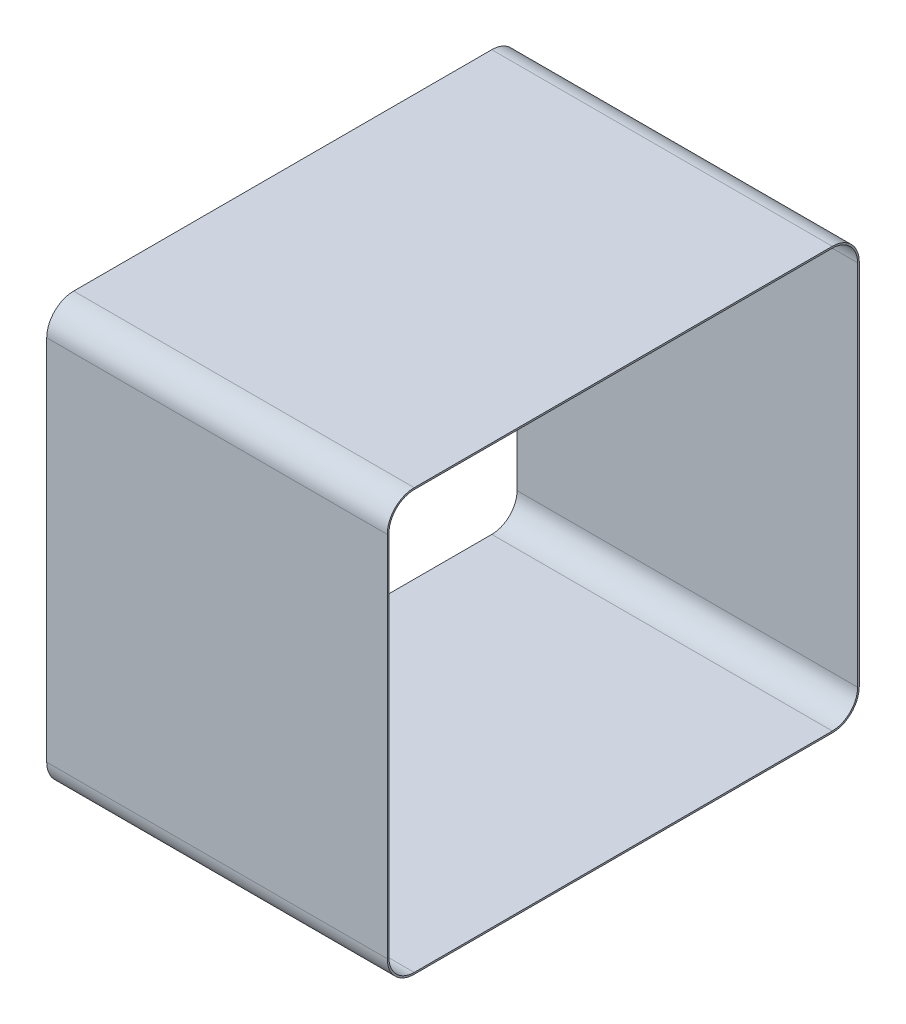
ISO-10303-21;
HEADER;
FILE_DESCRIPTION(('STEP AP214'),'2;1');
FILE_NAME('part.step','',(''),(''),'','','');
FILE_SCHEMA(('AUTOMOTIVE_DESIGN { 1 0 10303 214 1 1 1 1 }'));
ENDSEC;
DATA;
#1=APPLICATION_CONTEXT('core data for automotive mechanical design processes');
#2=APPLICATION_PROTOCOL_DEFINITION('international standard','automotive_design',2000,#1);
#3=PRODUCT_CONTEXT('',#1,'mechanical');
#4=PRODUCT('Part','Part','',(#3));
#5=PRODUCT_RELATED_PRODUCT_CATEGORY('part','',(#4));
#6=PRODUCT_DEFINITION_FORMATION('','',#4);
#7=PRODUCT_DEFINITION_CONTEXT('part definition',#1,'design');
#8=PRODUCT_DEFINITION('design','',#6,#7);
#9=PRODUCT_DEFINITION_SHAPE('','',#8);
#10=(LENGTH_UNIT() NAMED_UNIT(*) SI_UNIT(.MILLI.,.METRE.));
#11=(NAMED_UNIT(*) PLANE_ANGLE_UNIT() SI_UNIT($,.RADIAN.));
#12=(NAMED_UNIT(*) SI_UNIT($,.STERADIAN.) SOLID_ANGLE_UNIT());
#13=UNCERTAINTY_MEASURE_WITH_UNIT(LENGTH_MEASURE(1.E-05),#10,'distance_accuracy_value','');
#14=(GEOMETRIC_REPRESENTATION_CONTEXT(3) GLOBAL_UNCERTAINTY_ASSIGNED_CONTEXT((#13)) GLOBAL_UNIT_ASSIGNED_CONTEXT((#10,
#11,#12)) REPRESENTATION_CONTEXT('',''));
#15=CARTESIAN_POINT('',(0.,0.,0.));
#16=DIRECTION('',(0.,0.,1.));
#17=DIRECTION('',(1.,0.,0.));
#18=AXIS2_PLACEMENT_3D('',#15,#16,#17);
#19=CARTESIAN_POINT('',(0.505,0.,0.7));
#20=DIRECTION('',(1.,0.,0.));
#21=DIRECTION('',(0.,1.,0.));
#22=AXIS2_PLACEMENT_3D('',#19,#20,#21);
#23=PLANE('',#22);
#24=DIRECTION('',(0.,1.,0.));
#25=VECTOR('',#24,1.);
#26=CARTESIAN_POINT('',(0.505,-0.545,1.395));
#27=LINE('',#26,#25);
#28=CARTESIAN_POINT('',(0.505,-0.545,1.395));
#29=VERTEX_POINT('',#28);
#30=CARTESIAN_POINT('',(0.505,0.545,1.395));
#31=VERTEX_POINT('',#30);
#32=EDGE_CURVE('E256',#29,#31,#27,.T.);
#33=ORIENTED_EDGE('',*,*,#32,.T.);
#34=CARTESIAN_POINT('',(0.505,0.545,1.32));
#35=DIRECTION('',(-1.,0.,0.));
#36=DIRECTION('',(0.,-1.,0.));
#37=AXIS2_PLACEMENT_3D('',#34,#35,#36);
#38=CIRCLE('',#37,0.075);
#39=CARTESIAN_POINT('',(0.505,0.62,1.32));
#40=VERTEX_POINT('',#39);
#41=EDGE_CURVE('E11',#31,#40,#38,.T.);
#42=ORIENTED_EDGE('',*,*,#41,.T.);
#43=DIRECTION('',(0.,0.,-1.));
#44=VECTOR('',#43,1.);
#45=CARTESIAN_POINT('',(0.505,0.62,1.32));
#46=LINE('',#45,#44);
#47=CARTESIAN_POINT('',(0.505,0.62,0.08));
#48=VERTEX_POINT('',#47);
#49=EDGE_CURVE('E26',#40,#48,#46,.T.);
#50=ORIENTED_EDGE('',*,*,#49,.T.);
#51=CARTESIAN_POINT('',(0.505,0.545,0.08));
#52=DIRECTION('',(-1.,0.,0.));
#53=DIRECTION('',(0.,0.,1.));
#54=AXIS2_PLACEMENT_3D('',#51,#52,#53);
#55=CIRCLE('',#54,0.075);
#56=CARTESIAN_POINT('',(0.505,0.545,0.005));
#57=VERTEX_POINT('',#56);
#58=EDGE_CURVE('E248',#48,#57,#55,.T.);
#59=ORIENTED_EDGE('',*,*,#58,.T.);
#60=DIRECTION('',(0.,-1.,0.));
#61=VECTOR('',#60,1.);
#62=CARTESIAN_POINT('',(0.505,0.545,0.005));
#63=LINE('',#62,#61);
#64=CARTESIAN_POINT('',(0.505,-0.545,0.005));
#65=VERTEX_POINT('',#64);
#66=EDGE_CURVE('E303',#57,#65,#63,.T.);
#67=ORIENTED_EDGE('',*,*,#66,.T.);
#68=CARTESIAN_POINT('',(0.505,-0.545,0.08));
#69=DIRECTION('',(-1.,0.,0.));
#70=DIRECTION('',(0.,1.,0.));
#71=AXIS2_PLACEMENT_3D('',#68,#69,#70);
#72=CIRCLE('',#71,0.075);
#73=CARTESIAN_POINT('',(0.505,-0.62,0.08));
#74=VERTEX_POINT('',#73);
#75=EDGE_CURVE('E239',#65,#74,#72,.T.);
#76=ORIENTED_EDGE('',*,*,#75,.T.);
#77=DIRECTION('',(0.,0.,1.));
#78=VECTOR('',#77,1.);
#79=CARTESIAN_POINT('',(0.505,-0.62,0.08));
#80=LINE('',#79,#78);
#81=CARTESIAN_POINT('',(0.505,-0.62,1.32));
#82=VERTEX_POINT('',#81);
#83=EDGE_CURVE('E296',#74,#82,#80,.T.);
#84=ORIENTED_EDGE('',*,*,#83,.T.);
#85=CARTESIAN_POINT('',(0.505,-0.545,1.32));
#86=DIRECTION('',(-1.,0.,0.));
#87=DIRECTION('',(0.,0.,-1.));
#88=AXIS2_PLACEMENT_3D('',#85,#86,#87);
#89=CIRCLE('',#88,0.075);
#90=EDGE_CURVE('E216',#82,#29,#89,.T.);
#91=ORIENTED_EDGE('',*,*,#90,.T.);
#92=EDGE_LOOP('',(#33,#42,#50,#59,#67,#76,#84,#91));
#93=FACE_BOUND('',#92,.T.);
#94=CARTESIAN_POINT('',(0.505,-0.545,0.08));
#95=DIRECTION('',(1.,0.,0.));
#96=DIRECTION('',(0.,-1.,0.));
#97=AXIS2_PLACEMENT_3D('',#94,#95,#96);
#98=CIRCLE('',#97,0.08);
#99=CARTESIAN_POINT('',(0.505,-0.625,0.08));
#100=VERTEX_POINT('',#99);
#101=CARTESIAN_POINT('',(0.505,-0.545,0.));
#102=VERTEX_POINT('',#101);
#103=EDGE_CURVE('E225',#100,#102,#98,.T.);
#104=ORIENTED_EDGE('',*,*,#103,.T.);
#105=DIRECTION('',(0.,1.,0.));
#106=VECTOR('',#105,1.);
#107=CARTESIAN_POINT('',(0.505,-0.545,0.));
#108=LINE('',#107,#106);
#109=CARTESIAN_POINT('',(0.505,0.545,0.));
#110=VERTEX_POINT('',#109);
#111=EDGE_CURVE('E260',#102,#110,#108,.T.);
#112=ORIENTED_EDGE('',*,*,#111,.T.);
#113=CARTESIAN_POINT('',(0.505,0.545,0.08));
#114=DIRECTION('',(1.,0.,0.));
#115=DIRECTION('',(0.,0.,-1.));
#116=AXIS2_PLACEMENT_3D('',#113,#114,#115);
#117=CIRCLE('',#116,0.08);
#118=CARTESIAN_POINT('',(0.505,0.625,0.08));
#119=VERTEX_POINT('',#118);
#120=EDGE_CURVE('E110',#110,#119,#117,.T.);
#121=ORIENTED_EDGE('',*,*,#120,.T.);
#122=DIRECTION('',(0.,0.,1.));
#123=VECTOR('',#122,1.);
#124=CARTESIAN_POINT('',(0.505,0.625,0.08));
#125=LINE('',#124,#123);
#126=CARTESIAN_POINT('',(0.505,0.625,1.32));
#127=VERTEX_POINT('',#126);
#128=EDGE_CURVE('E119',#119,#127,#125,.T.);
#129=ORIENTED_EDGE('',*,*,#128,.T.);
#130=CARTESIAN_POINT('',(0.505,0.545,1.32));
#131=DIRECTION('',(1.,0.,0.));
#132=DIRECTION('',(0.,1.,0.));
#133=AXIS2_PLACEMENT_3D('',#130,#131,#132);
#134=CIRCLE('',#133,0.08);
#135=CARTESIAN_POINT('',(0.505,0.545,1.4));
#136=VERTEX_POINT('',#135);
#137=EDGE_CURVE('E215',#127,#136,#134,.T.);
#138=ORIENTED_EDGE('',*,*,#137,.T.);
#139=DIRECTION('',(0.,-1.,0.));
#140=VECTOR('',#139,1.);
#141=CARTESIAN_POINT('',(0.505,0.545,1.4));
#142=LINE('',#141,#140);
#143=CARTESIAN_POINT('',(0.505,-0.545,1.4));
#144=VERTEX_POINT('',#143);
#145=EDGE_CURVE('E180',#136,#144,#142,.T.);
#146=ORIENTED_EDGE('',*,*,#145,.T.);
#147=CARTESIAN_POINT('',(0.505,-0.545,1.32));
#148=DIRECTION('',(1.,0.,0.));
#149=DIRECTION('',(0.,0.,1.));
#150=AXIS2_PLACEMENT_3D('',#147,#148,#149);
#151=CIRCLE('',#150,0.08);
#152=CARTESIAN_POINT('',(0.505,-0.625,1.32));
#153=VERTEX_POINT('',#152);
#154=EDGE_CURVE('E183',#144,#153,#151,.T.);
#155=ORIENTED_EDGE('',*,*,#154,.T.);
#156=DIRECTION('',(0.,0.,-1.));
#157=VECTOR('',#156,1.);
#158=CARTESIAN_POINT('',(0.505,-0.625,1.32));
#159=LINE('',#158,#157);
#160=EDGE_CURVE('E235',#153,#100,#159,.T.);
#161=ORIENTED_EDGE('',*,*,#160,.T.);
#162=EDGE_LOOP('',(#104,#112,#121,#129,#138,#146,#155,#161));
#163=FACE_BOUND('',#162,.T.);
#164=ADVANCED_FACE('F16',(#93,#163),#23,.T.);
#165=CARTESIAN_POINT('',(0.,0.545,1.32));
#166=DIRECTION('',(-1.,0.,0.));
#167=DIRECTION('',(0.,-1.,0.));
#168=AXIS2_PLACEMENT_3D('',#165,#166,#167);
#169=CYLINDRICAL_SURFACE('',#168,0.075);
#170=DIRECTION('',(1.,0.,0.));
#171=VECTOR('',#170,1.);
#172=CARTESIAN_POINT('',(0.,0.545,1.395));
#173=LINE('',#172,#171);
#174=CARTESIAN_POINT('',(-0.505,0.545,1.395));
#175=VERTEX_POINT('',#174);
#176=EDGE_CURVE('E252',#175,#31,#173,.T.);
#177=ORIENTED_EDGE('',*,*,#176,.F.);
#178=CARTESIAN_POINT('',(-0.505,0.545,1.32));
#179=DIRECTION('',(1.,0.,0.));
#180=DIRECTION('',(0.,-1.,0.));
#181=AXIS2_PLACEMENT_3D('',#178,#179,#180);
#182=CIRCLE('',#181,0.075);
#183=CARTESIAN_POINT('',(-0.505,0.62,1.32));
#184=VERTEX_POINT('',#183);
#185=EDGE_CURVE('E314',#184,#175,#182,.T.);
#186=ORIENTED_EDGE('',*,*,#185,.F.);
#187=DIRECTION('',(1.,0.,0.));
#188=VECTOR('',#187,1.);
#189=CARTESIAN_POINT('',(0.,0.62,1.32));
#190=LINE('',#189,#188);
#191=EDGE_CURVE('E244',#184,#40,#190,.T.);
#192=ORIENTED_EDGE('',*,*,#191,.T.);
#193=ORIENTED_EDGE('',*,*,#41,.F.);
#194=EDGE_LOOP('',(#177,#186,#192,#193));
#195=FACE_BOUND('',#194,.T.);
#196=ADVANCED_FACE('F388',(#195),#169,.F.);
#197=CARTESIAN_POINT('',(0.,0.62,0.08));
#198=DIRECTION('',(0.,-1.,0.));
#199=DIRECTION('',(-1.,0.,0.));
#200=AXIS2_PLACEMENT_3D('',#197,#198,#199);
#201=PLANE('',#200);
#202=ORIENTED_EDGE('',*,*,#191,.F.);
#203=DIRECTION('',(0.,0.,1.));
#204=VECTOR('',#203,1.);
#205=CARTESIAN_POINT('',(-0.505,0.62,1.32));
#206=LINE('',#205,#204);
#207=CARTESIAN_POINT('',(-0.505,0.62,0.08));
#208=VERTEX_POINT('',#207);
#209=EDGE_CURVE('E231',#208,#184,#206,.T.);
#210=ORIENTED_EDGE('',*,*,#209,.F.);
#211=DIRECTION('',(1.,0.,0.));
#212=VECTOR('',#211,1.);
#213=CARTESIAN_POINT('',(0.,0.62,0.08));
#214=LINE('',#213,#212);
#215=EDGE_CURVE('E306',#208,#48,#214,.T.);
#216=ORIENTED_EDGE('',*,*,#215,.T.);
#217=ORIENTED_EDGE('',*,*,#49,.F.);
#218=EDGE_LOOP('',(#202,#210,#216,#217));
#219=FACE_BOUND('',#218,.T.);
#220=ADVANCED_FACE('F373',(#219),#201,.T.);
#221=CARTESIAN_POINT('',(0.,0.545,0.08));
#222=DIRECTION('',(-1.,0.,0.));
#223=DIRECTION('',(0.,0.,1.));
#224=AXIS2_PLACEMENT_3D('',#221,#222,#223);
#225=CYLINDRICAL_SURFACE('',#224,0.075);
#226=ORIENTED_EDGE('',*,*,#215,.F.);
#227=CARTESIAN_POINT('',(-0.505,0.545,0.08));
#228=DIRECTION('',(1.,0.,0.));
#229=DIRECTION('',(0.,0.,1.));
#230=AXIS2_PLACEMENT_3D('',#227,#228,#229);
#231=CIRCLE('',#230,0.075);
#232=CARTESIAN_POINT('',(-0.505,0.545,0.005));
#233=VERTEX_POINT('',#232);
#234=EDGE_CURVE('E227',#233,#208,#231,.T.);
#235=ORIENTED_EDGE('',*,*,#234,.F.);
#236=DIRECTION('',(1.,0.,0.));
#237=VECTOR('',#236,1.);
#238=CARTESIAN_POINT('',(0.,0.545,0.005));
#239=LINE('',#238,#237);
#240=EDGE_CURVE('E242',#233,#57,#239,.T.);
#241=ORIENTED_EDGE('',*,*,#240,.T.);
#242=ORIENTED_EDGE('',*,*,#58,.F.);
#243=EDGE_LOOP('',(#226,#235,#241,#242));
#244=FACE_BOUND('',#243,.T.);
#245=ADVANCED_FACE('F370',(#244),#225,.F.);
#246=CARTESIAN_POINT('',(0.,-0.545,0.005));
#247=DIRECTION('',(0.,0.,1.));
#248=DIRECTION('',(0.,-1.,0.));
#249=AXIS2_PLACEMENT_3D('',#246,#247,#248);
#250=PLANE('',#249);
#251=ORIENTED_EDGE('',*,*,#240,.F.);
#252=DIRECTION('',(0.,1.,0.));
#253=VECTOR('',#252,1.);
#254=CARTESIAN_POINT('',(-0.505,0.545,0.005));
#255=LINE('',#254,#253);
#256=CARTESIAN_POINT('',(-0.505,-0.545,0.005));
#257=VERTEX_POINT('',#256);
#258=EDGE_CURVE('E211',#257,#233,#255,.T.);
#259=ORIENTED_EDGE('',*,*,#258,.F.);
#260=DIRECTION('',(1.,0.,0.));
#261=VECTOR('',#260,1.);
#262=CARTESIAN_POINT('',(0.,-0.545,0.005));
#263=LINE('',#262,#261);
#264=EDGE_CURVE('E243',#257,#65,#263,.T.);
#265=ORIENTED_EDGE('',*,*,#264,.T.);
#266=ORIENTED_EDGE('',*,*,#66,.F.);
#267=EDGE_LOOP('',(#251,#259,#265,#266));
#268=FACE_BOUND('',#267,.T.);
#269=ADVANCED_FACE('F366',(#268),#250,.T.);
#270=CARTESIAN_POINT('',(0.,-0.545,0.08));
#271=DIRECTION('',(-1.,0.,0.));
#272=DIRECTION('',(0.,1.,0.));
#273=AXIS2_PLACEMENT_3D('',#270,#271,#272);
#274=CYLINDRICAL_SURFACE('',#273,0.075);
#275=ORIENTED_EDGE('',*,*,#264,.F.);
#276=CARTESIAN_POINT('',(-0.505,-0.545,0.08));
#277=DIRECTION('',(1.,0.,0.));
#278=DIRECTION('',(0.,1.,0.));
#279=AXIS2_PLACEMENT_3D('',#276,#277,#278);
#280=CIRCLE('',#279,0.075);
#281=CARTESIAN_POINT('',(-0.505,-0.62,0.08));
#282=VERTEX_POINT('',#281);
#283=EDGE_CURVE('E301',#282,#257,#280,.T.);
#284=ORIENTED_EDGE('',*,*,#283,.F.);
#285=DIRECTION('',(1.,0.,0.));
#286=VECTOR('',#285,1.);
#287=CARTESIAN_POINT('',(0.,-0.62,0.08));
#288=LINE('',#287,#286);
#289=EDGE_CURVE('E219',#282,#74,#288,.T.);
#290=ORIENTED_EDGE('',*,*,#289,.T.);
#291=ORIENTED_EDGE('',*,*,#75,.F.);
#292=EDGE_LOOP('',(#275,#284,#290,#291));
#293=FACE_BOUND('',#292,.T.);
#294=ADVANCED_FACE('F387',(#293),#274,.F.);
#295=CARTESIAN_POINT('',(0.,-0.62,1.32));
#296=DIRECTION('',(0.,1.,0.));
#297=DIRECTION('',(0.,0.,-1.));
#298=AXIS2_PLACEMENT_3D('',#295,#296,#297);
#299=PLANE('',#298);
#300=ORIENTED_EDGE('',*,*,#289,.F.);
#301=DIRECTION('',(0.,0.,-1.));
#302=VECTOR('',#301,1.);
#303=CARTESIAN_POINT('',(-0.505,-0.62,0.08));
#304=LINE('',#303,#302);
#305=CARTESIAN_POINT('',(-0.505,-0.62,1.32));
#306=VERTEX_POINT('',#305);
#307=EDGE_CURVE('E297',#306,#282,#304,.T.);
#308=ORIENTED_EDGE('',*,*,#307,.F.);
#309=DIRECTION('',(1.,0.,0.));
#310=VECTOR('',#309,1.);
#311=CARTESIAN_POINT('',(0.,-0.62,1.32));
#312=LINE('',#311,#310);
#313=EDGE_CURVE('E220',#306,#82,#312,.T.);
#314=ORIENTED_EDGE('',*,*,#313,.T.);
#315=ORIENTED_EDGE('',*,*,#83,.F.);
#316=EDGE_LOOP('',(#300,#308,#314,#315));
#317=FACE_BOUND('',#316,.T.);
#318=ADVANCED_FACE('F384',(#317),#299,.T.);
#319=CARTESIAN_POINT('',(0.,-0.545,1.32));
#320=DIRECTION('',(-1.,0.,0.));
#321=DIRECTION('',(0.,0.,-1.));
#322=AXIS2_PLACEMENT_3D('',#319,#320,#321);
#323=CYLINDRICAL_SURFACE('',#322,0.075);
#324=ORIENTED_EDGE('',*,*,#313,.F.);
#325=CARTESIAN_POINT('',(-0.505,-0.545,1.32));
#326=DIRECTION('',(1.,0.,0.));
#327=DIRECTION('',(0.,0.,-1.));
#328=AXIS2_PLACEMENT_3D('',#325,#326,#327);
#329=CIRCLE('',#328,0.075);
#330=CARTESIAN_POINT('',(-0.505,-0.545,1.395));
#331=VERTEX_POINT('',#330);
#332=EDGE_CURVE('E302',#331,#306,#329,.T.);
#333=ORIENTED_EDGE('',*,*,#332,.F.);
#334=DIRECTION('',(-1.,0.,0.));
#335=VECTOR('',#334,1.);
#336=CARTESIAN_POINT('',(0.,-0.545,1.395));
#337=LINE('',#336,#335);
#338=EDGE_CURVE('E257',#29,#331,#337,.T.);
#339=ORIENTED_EDGE('',*,*,#338,.F.);
#340=ORIENTED_EDGE('',*,*,#90,.F.);
#341=EDGE_LOOP('',(#324,#333,#339,#340));
#342=FACE_BOUND('',#341,.T.);
#343=ADVANCED_FACE('F383',(#342),#323,.F.);
#344=CARTESIAN_POINT('',(0.,0.545,1.395));
#345=DIRECTION('',(0.,0.,-1.));
#346=DIRECTION('',(-1.,0.,0.));
#347=AXIS2_PLACEMENT_3D('',#344,#345,#346);
#348=PLANE('',#347);
#349=ORIENTED_EDGE('',*,*,#338,.T.);
#350=DIRECTION('',(0.,-1.,0.));
#351=VECTOR('',#350,1.);
#352=CARTESIAN_POINT('',(-0.505,-0.545,1.395));
#353=LINE('',#352,#351);
#354=EDGE_CURVE('E274',#175,#331,#353,.T.);
#355=ORIENTED_EDGE('',*,*,#354,.F.);
#356=ORIENTED_EDGE('',*,*,#176,.T.);
#357=ORIENTED_EDGE('',*,*,#32,.F.);
#358=EDGE_LOOP('',(#349,#355,#356,#357));
#359=FACE_BOUND('',#358,.T.);
#360=ADVANCED_FACE('F378',(#359),#348,.T.);
#361=CARTESIAN_POINT('',(0.,0.545,0.));
#362=DIRECTION('',(0.,0.,-1.));
#363=DIRECTION('',(-1.,0.,0.));
#364=AXIS2_PLACEMENT_3D('',#361,#362,#363);
#365=PLANE('',#364);
#366=DIRECTION('',(1.,0.,0.));
#367=VECTOR('',#366,1.);
#368=CARTESIAN_POINT('',(0.,-0.545,0.));
#369=LINE('',#368,#367);
#370=CARTESIAN_POINT('',(-0.505,-0.545,0.));
#371=VERTEX_POINT('',#370);
#372=EDGE_CURVE('E221',#371,#102,#369,.T.);
#373=ORIENTED_EDGE('',*,*,#372,.F.);
#374=DIRECTION('',(0.,-1.,0.));
#375=VECTOR('',#374,1.);
#376=CARTESIAN_POINT('',(-0.505,-0.545,0.));
#377=LINE('',#376,#375);
#378=CARTESIAN_POINT('',(-0.505,0.545,0.));
#379=VERTEX_POINT('',#378);
#380=EDGE_CURVE('E264',#379,#371,#377,.T.);
#381=ORIENTED_EDGE('',*,*,#380,.F.);
#382=DIRECTION('',(1.,0.,0.));
#383=VECTOR('',#382,1.);
#384=CARTESIAN_POINT('',(0.,0.545,0.));
#385=LINE('',#384,#383);
#386=EDGE_CURVE('E277',#379,#110,#385,.T.);
#387=ORIENTED_EDGE('',*,*,#386,.T.);
#388=ORIENTED_EDGE('',*,*,#111,.F.);
#389=EDGE_LOOP('',(#373,#381,#387,#388));
#390=FACE_BOUND('',#389,.T.);
#391=ADVANCED_FACE('F405',(#390),#365,.T.);
#392=CARTESIAN_POINT('',(0.,0.545,0.08));
#393=DIRECTION('',(-1.,0.,0.));
#394=DIRECTION('',(0.,0.,-1.));
#395=AXIS2_PLACEMENT_3D('',#392,#393,#394);
#396=CYLINDRICAL_SURFACE('',#395,0.08);
#397=ORIENTED_EDGE('',*,*,#386,.F.);
#398=CARTESIAN_POINT('',(-0.505,0.545,0.08));
#399=DIRECTION('',(-1.,0.,0.));
#400=DIRECTION('',(0.,0.,-1.));
#401=AXIS2_PLACEMENT_3D('',#398,#399,#400);
#402=CIRCLE('',#401,0.08);
#403=CARTESIAN_POINT('',(-0.505,0.625,0.08));
#404=VERTEX_POINT('',#403);
#405=EDGE_CURVE('E238',#404,#379,#402,.T.);
#406=ORIENTED_EDGE('',*,*,#405,.F.);
#407=DIRECTION('',(1.,0.,0.));
#408=VECTOR('',#407,1.);
#409=CARTESIAN_POINT('',(0.,0.625,0.08));
#410=LINE('',#409,#408);
#411=EDGE_CURVE('E251',#404,#119,#410,.T.);
#412=ORIENTED_EDGE('',*,*,#411,.T.);
#413=ORIENTED_EDGE('',*,*,#120,.F.);
#414=EDGE_LOOP('',(#397,#406,#412,#413));
#415=FACE_BOUND('',#414,.T.);
#416=ADVANCED_FACE('F402',(#415),#396,.T.);
#417=CARTESIAN_POINT('',(0.,0.625,1.32));
#418=DIRECTION('',(0.,1.,0.));
#419=DIRECTION('',(0.,0.,-1.));
#420=AXIS2_PLACEMENT_3D('',#417,#418,#419);
#421=PLANE('',#420);
#422=ORIENTED_EDGE('',*,*,#411,.F.);
#423=DIRECTION('',(0.,0.,-1.));
#424=VECTOR('',#423,1.);
#425=CARTESIAN_POINT('',(-0.505,0.625,0.08));
#426=LINE('',#425,#424);
#427=CARTESIAN_POINT('',(-0.505,0.625,1.32));
#428=VERTEX_POINT('',#427);
#429=EDGE_CURVE('E194',#428,#404,#426,.T.);
#430=ORIENTED_EDGE('',*,*,#429,.F.);
#431=DIRECTION('',(1.,0.,0.));
#432=VECTOR('',#431,1.);
#433=CARTESIAN_POINT('',(0.,0.625,1.32));
#434=LINE('',#433,#432);
#435=EDGE_CURVE('E189',#428,#127,#434,.T.);
#436=ORIENTED_EDGE('',*,*,#435,.T.);
#437=ORIENTED_EDGE('',*,*,#128,.F.);
#438=EDGE_LOOP('',(#422,#430,#436,#437));
#439=FACE_BOUND('',#438,.T.);
#440=ADVANCED_FACE('F400',(#439),#421,.T.);
#441=CARTESIAN_POINT('',(0.,0.545,1.32));
#442=DIRECTION('',(-1.,0.,0.));
#443=DIRECTION('',(0.,1.,0.));
#444=AXIS2_PLACEMENT_3D('',#441,#442,#443);
#445=CYLINDRICAL_SURFACE('',#444,0.08);
#446=ORIENTED_EDGE('',*,*,#435,.F.);
#447=CARTESIAN_POINT('',(-0.505,0.545,1.32));
#448=DIRECTION('',(-1.,0.,0.));
#449=DIRECTION('',(0.,1.,0.));
#450=AXIS2_PLACEMENT_3D('',#447,#448,#449);
#451=CIRCLE('',#450,0.08);
#452=CARTESIAN_POINT('',(-0.505,0.545,1.4));
#453=VERTEX_POINT('',#452);
#454=EDGE_CURVE('E186',#453,#428,#451,.T.);
#455=ORIENTED_EDGE('',*,*,#454,.F.);
#456=DIRECTION('',(1.,0.,0.));
#457=VECTOR('',#456,1.);
#458=CARTESIAN_POINT('',(0.,0.545,1.4));
#459=LINE('',#458,#457);
#460=EDGE_CURVE('E173',#453,#136,#459,.T.);
#461=ORIENTED_EDGE('',*,*,#460,.T.);
#462=ORIENTED_EDGE('',*,*,#137,.F.);
#463=EDGE_LOOP('',(#446,#455,#461,#462));
#464=FACE_BOUND('',#463,.T.);
#465=ADVANCED_FACE('F187',(#464),#445,.T.);
#466=CARTESIAN_POINT('',(0.,-0.545,1.4));
#467=DIRECTION('',(0.,0.,1.));
#468=DIRECTION('',(1.,0.,0.));
#469=AXIS2_PLACEMENT_3D('',#466,#467,#468);
#470=PLANE('',#469);
#471=ORIENTED_EDGE('',*,*,#460,.F.);
#472=DIRECTION('',(0.,1.,0.));
#473=VECTOR('',#472,1.);
#474=CARTESIAN_POINT('',(-0.505,0.545,1.4));
#475=LINE('',#474,#473);
#476=CARTESIAN_POINT('',(-0.505,-0.545,1.4));
#477=VERTEX_POINT('',#476);
#478=EDGE_CURVE('E178',#477,#453,#475,.T.);
#479=ORIENTED_EDGE('',*,*,#478,.F.);
#480=DIRECTION('',(1.,0.,0.));
#481=VECTOR('',#480,1.);
#482=CARTESIAN_POINT('',(0.,-0.545,1.4));
#483=LINE('',#482,#481);
#484=EDGE_CURVE('E232',#477,#144,#483,.T.);
#485=ORIENTED_EDGE('',*,*,#484,.T.);
#486=ORIENTED_EDGE('',*,*,#145,.F.);
#487=EDGE_LOOP('',(#471,#479,#485,#486));
#488=FACE_BOUND('',#487,.T.);
#489=ADVANCED_FACE('F175',(#488),#470,.T.);
#490=CARTESIAN_POINT('',(0.,-0.545,1.32));
#491=DIRECTION('',(-1.,0.,0.));
#492=DIRECTION('',(0.,0.,1.));
#493=AXIS2_PLACEMENT_3D('',#490,#491,#492);
#494=CYLINDRICAL_SURFACE('',#493,0.08);
#495=ORIENTED_EDGE('',*,*,#484,.F.);
#496=CARTESIAN_POINT('',(-0.505,-0.545,1.32));
#497=DIRECTION('',(-1.,0.,0.));
#498=DIRECTION('',(0.,0.,1.));
#499=AXIS2_PLACEMENT_3D('',#496,#497,#498);
#500=CIRCLE('',#499,0.08);
#501=CARTESIAN_POINT('',(-0.505,-0.625,1.32));
#502=VERTEX_POINT('',#501);
#503=EDGE_CURVE('E200',#502,#477,#500,.T.);
#504=ORIENTED_EDGE('',*,*,#503,.F.);
#505=DIRECTION('',(1.,0.,0.));
#506=VECTOR('',#505,1.);
#507=CARTESIAN_POINT('',(0.,-0.625,1.32));
#508=LINE('',#507,#506);
#509=EDGE_CURVE('E270',#502,#153,#508,.T.);
#510=ORIENTED_EDGE('',*,*,#509,.T.);
#511=ORIENTED_EDGE('',*,*,#154,.F.);
#512=EDGE_LOOP('',(#495,#504,#510,#511));
#513=FACE_BOUND('',#512,.T.);
#514=ADVANCED_FACE('F656',(#513),#494,.T.);
#515=CARTESIAN_POINT('',(0.,-0.625,0.08));
#516=DIRECTION('',(0.,-1.,0.));
#517=DIRECTION('',(-1.,0.,0.));
#518=AXIS2_PLACEMENT_3D('',#515,#516,#517);
#519=PLANE('',#518);
#520=ORIENTED_EDGE('',*,*,#509,.F.);
#521=DIRECTION('',(0.,0.,1.));
#522=VECTOR('',#521,1.);
#523=CARTESIAN_POINT('',(-0.505,-0.625,1.32));
#524=LINE('',#523,#522);
#525=CARTESIAN_POINT('',(-0.505,-0.625,0.08));
#526=VERTEX_POINT('',#525);
#527=EDGE_CURVE('E207',#526,#502,#524,.T.);
#528=ORIENTED_EDGE('',*,*,#527,.F.);
#529=DIRECTION('',(-1.,0.,0.));
#530=VECTOR('',#529,1.);
#531=CARTESIAN_POINT('',(0.,-0.625,0.08));
#532=LINE('',#531,#530);
#533=EDGE_CURVE('E226',#100,#526,#532,.T.);
#534=ORIENTED_EDGE('',*,*,#533,.F.);
#535=ORIENTED_EDGE('',*,*,#160,.F.);
#536=EDGE_LOOP('',(#520,#528,#534,#535));
#537=FACE_BOUND('',#536,.T.);
#538=ADVANCED_FACE('F641',(#537),#519,.T.);
#539=CARTESIAN_POINT('',(0.,-0.545,0.08));
#540=DIRECTION('',(-1.,0.,0.));
#541=DIRECTION('',(0.,-1.,0.));
#542=AXIS2_PLACEMENT_3D('',#539,#540,#541);
#543=CYLINDRICAL_SURFACE('',#542,0.08);
#544=ORIENTED_EDGE('',*,*,#533,.T.);
#545=CARTESIAN_POINT('',(-0.505,-0.545,0.08));
#546=DIRECTION('',(-1.,0.,0.));
#547=DIRECTION('',(0.,-1.,0.));
#548=AXIS2_PLACEMENT_3D('',#545,#546,#547);
#549=CIRCLE('',#548,0.08);
#550=EDGE_CURVE('E19',#371,#526,#549,.T.);
#551=ORIENTED_EDGE('',*,*,#550,.F.);
#552=ORIENTED_EDGE('',*,*,#372,.T.);
#553=ORIENTED_EDGE('',*,*,#103,.F.);
#554=EDGE_LOOP('',(#544,#551,#552,#553));
#555=FACE_BOUND('',#554,.T.);
#556=ADVANCED_FACE('F415',(#555),#543,.T.);
#557=CARTESIAN_POINT('',(-0.505,0.,0.7));
#558=DIRECTION('',(1.,0.,0.));
#559=DIRECTION('',(0.,1.,0.));
#560=AXIS2_PLACEMENT_3D('',#557,#558,#559);
#561=PLANE('',#560);
#562=ORIENTED_EDGE('',*,*,#354,.T.);
#563=ORIENTED_EDGE('',*,*,#332,.T.);
#564=ORIENTED_EDGE('',*,*,#307,.T.);
#565=ORIENTED_EDGE('',*,*,#283,.T.);
#566=ORIENTED_EDGE('',*,*,#258,.T.);
#567=ORIENTED_EDGE('',*,*,#234,.T.);
#568=ORIENTED_EDGE('',*,*,#209,.T.);
#569=ORIENTED_EDGE('',*,*,#185,.T.);
#570=EDGE_LOOP('',(#562,#563,#564,#565,#566,#567,#568,#569));
#571=FACE_BOUND('',#570,.T.);
#572=ORIENTED_EDGE('',*,*,#550,.T.);
#573=ORIENTED_EDGE('',*,*,#527,.T.);
#574=ORIENTED_EDGE('',*,*,#503,.T.);
#575=ORIENTED_EDGE('',*,*,#478,.T.);
#576=ORIENTED_EDGE('',*,*,#454,.T.);
#577=ORIENTED_EDGE('',*,*,#429,.T.);
#578=ORIENTED_EDGE('',*,*,#405,.T.);
#579=ORIENTED_EDGE('',*,*,#380,.T.);
#580=EDGE_LOOP('',(#572,#573,#574,#575,#576,#577,#578,#579));
#581=FACE_BOUND('',#580,.T.);
#582=ADVANCED_FACE('F197',(#571,#581),#561,.F.);
#583=CLOSED_SHELL('',(#164,#196,#220,#245,#269,#294,#318,#343,#360,#391,#416,#440,#465,#489,
#514,#538,#556,#582));
#584=MANIFOLD_SOLID_BREP('B1',#583);
#585=ADVANCED_BREP_SHAPE_REPRESENTATION('',(#18,#584),#14);
#586=SHAPE_DEFINITION_REPRESENTATION(#9,#585);
ENDSEC;
END-ISO-10303-21;
